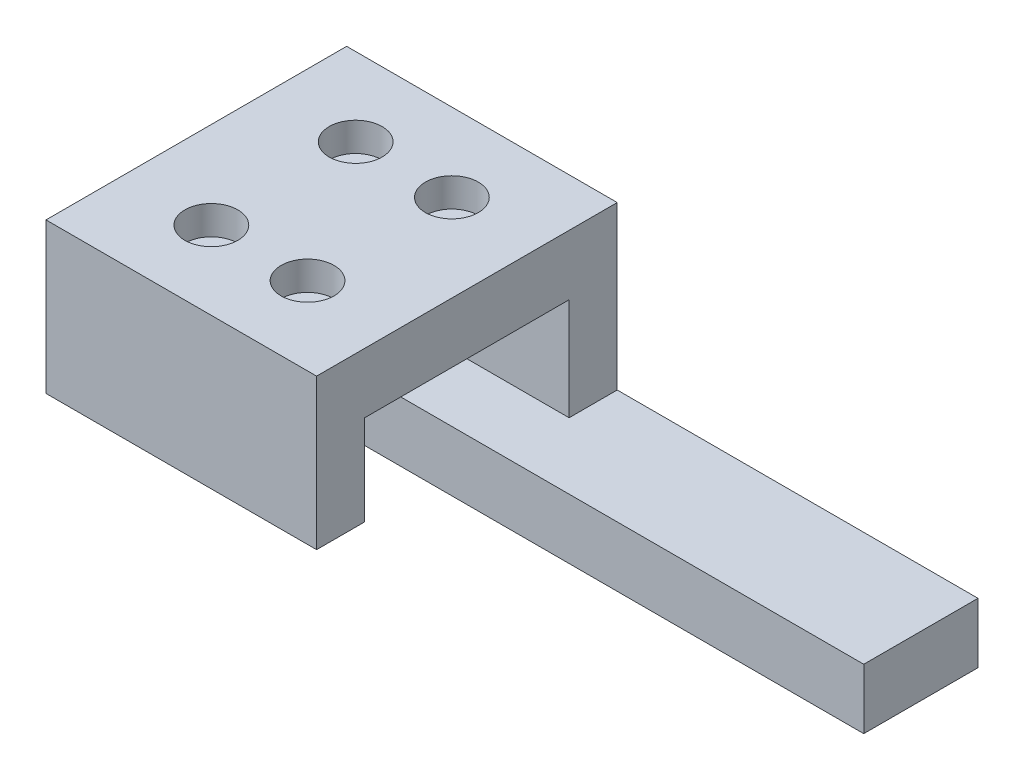
ISO-10303-21;
HEADER;
FILE_DESCRIPTION(('STEP AP214'),'2;1');
FILE_NAME('part.step','',(''),(''),'','','');
FILE_SCHEMA(('AUTOMOTIVE_DESIGN { 1 0 10303 214 1 1 1 1 }'));
ENDSEC;
DATA;
#1=APPLICATION_CONTEXT('core data for automotive mechanical design processes');
#2=APPLICATION_PROTOCOL_DEFINITION('international standard','automotive_design',2000,#1);
#3=PRODUCT_CONTEXT('',#1,'mechanical');
#4=PRODUCT('Part','Part','',(#3));
#5=PRODUCT_RELATED_PRODUCT_CATEGORY('part','',(#4));
#6=PRODUCT_DEFINITION_FORMATION('','',#4);
#7=PRODUCT_DEFINITION_CONTEXT('part definition',#1,'design');
#8=PRODUCT_DEFINITION('design','',#6,#7);
#9=PRODUCT_DEFINITION_SHAPE('','',#8);
#10=(LENGTH_UNIT() NAMED_UNIT(*) SI_UNIT(.MILLI.,.METRE.));
#11=(NAMED_UNIT(*) PLANE_ANGLE_UNIT() SI_UNIT($,.RADIAN.));
#12=(NAMED_UNIT(*) SI_UNIT($,.STERADIAN.) SOLID_ANGLE_UNIT());
#13=UNCERTAINTY_MEASURE_WITH_UNIT(LENGTH_MEASURE(1.E-05),#10,'distance_accuracy_value','');
#14=(GEOMETRIC_REPRESENTATION_CONTEXT(3) GLOBAL_UNCERTAINTY_ASSIGNED_CONTEXT((#13)) GLOBAL_UNIT_ASSIGNED_CONTEXT((#10,
#11,#12)) REPRESENTATION_CONTEXT('',''));
#15=CARTESIAN_POINT('',(0.,0.,0.));
#16=DIRECTION('',(0.,0.,1.));
#17=DIRECTION('',(1.,0.,0.));
#18=AXIS2_PLACEMENT_3D('',#15,#16,#17);
#19=CARTESIAN_POINT('',(0.,0.,0.));
#20=DIRECTION('',(0.,1.,0.));
#21=DIRECTION('',(0.,0.,1.));
#22=AXIS2_PLACEMENT_3D('',#19,#20,#21);
#23=PLANE('',#22);
#24=CARTESIAN_POINT('',(-4.,0.,6.));
#25=DIRECTION('',(0.,1.,0.));
#26=DIRECTION('',(0.,0.,1.));
#27=AXIS2_PLACEMENT_3D('',#24,#25,#26);
#28=CIRCLE('',#27,1.2);
#29=CARTESIAN_POINT('',(-4.,0.,7.2));
#30=VERTEX_POINT('',#29);
#31=EDGE_CURVE('E195',#30,#30,#28,.T.);
#32=ORIENTED_EDGE('',*,*,#31,.T.);
#33=EDGE_LOOP('',(#32));
#34=FACE_BOUND('',#33,.T.);
#35=CARTESIAN_POINT('',(4.,0.,6.));
#36=DIRECTION('',(0.,1.,0.));
#37=DIRECTION('',(0.,0.,1.));
#38=AXIS2_PLACEMENT_3D('',#35,#36,#37);
#39=CIRCLE('',#38,1.2);
#40=CARTESIAN_POINT('',(4.,0.,7.2));
#41=VERTEX_POINT('',#40);
#42=EDGE_CURVE('E199',#41,#41,#39,.T.);
#43=ORIENTED_EDGE('',*,*,#42,.T.);
#44=EDGE_LOOP('',(#43));
#45=FACE_BOUND('',#44,.T.);
#46=CARTESIAN_POINT('',(-4.,0.,-6.));
#47=DIRECTION('',(0.,1.,0.));
#48=DIRECTION('',(0.,0.,1.));
#49=AXIS2_PLACEMENT_3D('',#46,#47,#48);
#50=CIRCLE('',#49,1.2);
#51=CARTESIAN_POINT('',(-4.,0.,-4.8));
#52=VERTEX_POINT('',#51);
#53=EDGE_CURVE('E203',#52,#52,#50,.T.);
#54=ORIENTED_EDGE('',*,*,#53,.T.);
#55=EDGE_LOOP('',(#54));
#56=FACE_BOUND('',#55,.T.);
#57=CARTESIAN_POINT('',(4.,0.,-6.));
#58=DIRECTION('',(0.,1.,0.));
#59=DIRECTION('',(0.,0.,1.));
#60=AXIS2_PLACEMENT_3D('',#57,#58,#59);
#61=CIRCLE('',#60,1.2);
#62=CARTESIAN_POINT('',(4.,0.,-4.8));
#63=VERTEX_POINT('',#62);
#64=EDGE_CURVE('E73',#63,#63,#61,.T.);
#65=ORIENTED_EDGE('',*,*,#64,.T.);
#66=EDGE_LOOP('',(#65));
#67=FACE_BOUND('',#66,.T.);
#68=DIRECTION('',(1.,0.,0.));
#69=VECTOR('',#68,1.);
#70=CARTESIAN_POINT('',(0.,0.,8.5));
#71=LINE('',#70,#69);
#72=CARTESIAN_POINT('',(-11.25,0.,8.5));
#73=VERTEX_POINT('',#72);
#74=CARTESIAN_POINT('',(11.25,0.,8.5));
#75=VERTEX_POINT('',#74);
#76=EDGE_CURVE('E164',#73,#75,#71,.T.);
#77=ORIENTED_EDGE('',*,*,#76,.F.);
#78=DIRECTION('',(0.,0.,-1.));
#79=VECTOR('',#78,1.);
#80=CARTESIAN_POINT('',(-11.25,0.,8.5));
#81=LINE('',#80,#79);
#82=CARTESIAN_POINT('',(-11.25,0.,-8.5));
#83=VERTEX_POINT('',#82);
#84=EDGE_CURVE('E175',#73,#83,#81,.T.);
#85=ORIENTED_EDGE('',*,*,#84,.T.);
#86=DIRECTION('',(1.,0.,0.));
#87=VECTOR('',#86,1.);
#88=CARTESIAN_POINT('',(0.,0.,-8.5));
#89=LINE('',#88,#87);
#90=CARTESIAN_POINT('',(11.25,0.,-8.5));
#91=VERTEX_POINT('',#90);
#92=EDGE_CURVE('E174',#83,#91,#89,.T.);
#93=ORIENTED_EDGE('',*,*,#92,.T.);
#94=DIRECTION('',(0.,0.,-1.));
#95=VECTOR('',#94,1.);
#96=CARTESIAN_POINT('',(11.25,0.,8.5));
#97=LINE('',#96,#95);
#98=EDGE_CURVE('E158',#75,#91,#97,.T.);
#99=ORIENTED_EDGE('',*,*,#98,.F.);
#100=EDGE_LOOP('',(#77,#85,#93,#99));
#101=FACE_BOUND('',#100,.T.);
#102=ADVANCED_FACE('F69',(#34,#45,#56,#67,#101),#23,.F.);
#103=CARTESIAN_POINT('',(11.25,5.,8.5));
#104=DIRECTION('',(-1.,0.,0.));
#105=DIRECTION('',(0.,0.,1.));
#106=AXIS2_PLACEMENT_3D('',#103,#104,#105);
#107=PLANE('',#106);
#108=DIRECTION('',(0.,1.,0.));
#109=VECTOR('',#108,1.);
#110=CARTESIAN_POINT('',(11.25,-13.5,-8.5));
#111=LINE('',#110,#109);
#112=CARTESIAN_POINT('',(11.25,-8.5,-8.5));
#113=VERTEX_POINT('',#112);
#114=EDGE_CURVE('E238',#113,#91,#111,.T.);
#115=ORIENTED_EDGE('',*,*,#114,.F.);
#116=DIRECTION('',(0.,0.,1.));
#117=VECTOR('',#116,1.);
#118=CARTESIAN_POINT('',(11.25,-8.5,0.));
#119=LINE('',#118,#117);
#120=CARTESIAN_POINT('',(11.25,-8.5,-12.5));
#121=VERTEX_POINT('',#120);
#122=EDGE_CURVE('E86',#121,#113,#119,.T.);
#123=ORIENTED_EDGE('',*,*,#122,.F.);
#124=DIRECTION('',(0.,-1.,0.));
#125=VECTOR('',#124,1.);
#126=CARTESIAN_POINT('',(11.25,5.,-12.5));
#127=LINE('',#126,#125);
#128=CARTESIAN_POINT('',(11.25,5.,-12.5));
#129=VERTEX_POINT('',#128);
#130=EDGE_CURVE('E189',#129,#121,#127,.T.);
#131=ORIENTED_EDGE('',*,*,#130,.F.);
#132=DIRECTION('',(0.,0.,-1.));
#133=VECTOR('',#132,1.);
#134=CARTESIAN_POINT('',(11.25,5.,8.5));
#135=LINE('',#134,#133);
#136=CARTESIAN_POINT('',(11.25,5.,12.5));
#137=VERTEX_POINT('',#136);
#138=EDGE_CURVE('E78',#137,#129,#135,.T.);
#139=ORIENTED_EDGE('',*,*,#138,.F.);
#140=DIRECTION('',(0.,-1.,0.));
#141=VECTOR('',#140,1.);
#142=CARTESIAN_POINT('',(11.25,5.,12.5));
#143=LINE('',#142,#141);
#144=CARTESIAN_POINT('',(11.25,-7.5,12.5));
#145=VERTEX_POINT('',#144);
#146=EDGE_CURVE('E192',#137,#145,#143,.T.);
#147=ORIENTED_EDGE('',*,*,#146,.T.);
#148=DIRECTION('',(0.,0.,1.));
#149=VECTOR('',#148,1.);
#150=CARTESIAN_POINT('',(11.25,-7.5,0.));
#151=LINE('',#150,#149);
#152=CARTESIAN_POINT('',(11.25,-7.5,8.5));
#153=VERTEX_POINT('',#152);
#154=EDGE_CURVE('E160',#153,#145,#151,.T.);
#155=ORIENTED_EDGE('',*,*,#154,.F.);
#156=DIRECTION('',(0.,1.,0.));
#157=VECTOR('',#156,1.);
#158=CARTESIAN_POINT('',(11.25,-31.3527897640529,8.5));
#159=LINE('',#158,#157);
#160=EDGE_CURVE('E154',#153,#75,#159,.T.);
#161=ORIENTED_EDGE('',*,*,#160,.T.);
#162=ORIENTED_EDGE('',*,*,#98,.T.);
#163=EDGE_LOOP('',(#115,#123,#131,#139,#147,#155,#161,#162));
#164=FACE_BOUND('',#163,.T.);
#165=ADVANCED_FACE('F156',(#164),#107,.F.);
#166=CARTESIAN_POINT('',(-11.25,5.,8.5));
#167=DIRECTION('',(-1.,0.,0.));
#168=DIRECTION('',(0.,0.,1.));
#169=AXIS2_PLACEMENT_3D('',#166,#167,#168);
#170=PLANE('',#169);
#171=ORIENTED_EDGE('',*,*,#84,.F.);
#172=DIRECTION('',(0.,1.,0.));
#173=VECTOR('',#172,1.);
#174=CARTESIAN_POINT('',(-11.25,-31.3527897640529,8.5));
#175=LINE('',#174,#173);
#176=CARTESIAN_POINT('',(-11.25,-7.5,8.5));
#177=VERTEX_POINT('',#176);
#178=EDGE_CURVE('E163',#177,#73,#175,.T.);
#179=ORIENTED_EDGE('',*,*,#178,.F.);
#180=DIRECTION('',(0.,0.,1.));
#181=VECTOR('',#180,1.);
#182=CARTESIAN_POINT('',(-11.25,-7.5,0.));
#183=LINE('',#182,#181);
#184=CARTESIAN_POINT('',(-11.25,-7.5,12.5));
#185=VERTEX_POINT('',#184);
#186=EDGE_CURVE('E349',#177,#185,#183,.T.);
#187=ORIENTED_EDGE('',*,*,#186,.T.);
#188=DIRECTION('',(0.,-1.,0.));
#189=VECTOR('',#188,1.);
#190=CARTESIAN_POINT('',(-11.25,5.,12.5));
#191=LINE('',#190,#189);
#192=CARTESIAN_POINT('',(-11.25,5.,12.5));
#193=VERTEX_POINT('',#192);
#194=EDGE_CURVE('E179',#193,#185,#191,.T.);
#195=ORIENTED_EDGE('',*,*,#194,.F.);
#196=DIRECTION('',(0.,0.,-1.));
#197=VECTOR('',#196,1.);
#198=CARTESIAN_POINT('',(-11.25,5.,8.5));
#199=LINE('',#198,#197);
#200=CARTESIAN_POINT('',(-11.25,5.,-12.5));
#201=VERTEX_POINT('',#200);
#202=EDGE_CURVE('E14',#193,#201,#199,.T.);
#203=ORIENTED_EDGE('',*,*,#202,.T.);
#204=DIRECTION('',(0.,-1.,0.));
#205=VECTOR('',#204,1.);
#206=CARTESIAN_POINT('',(-11.25,5.,-12.5));
#207=LINE('',#206,#205);
#208=CARTESIAN_POINT('',(-11.25,-13.5,-12.5));
#209=VERTEX_POINT('',#208);
#210=EDGE_CURVE('E176',#201,#209,#207,.T.);
#211=ORIENTED_EDGE('',*,*,#210,.T.);
#212=DIRECTION('',(0.,0.,-1.));
#213=VECTOR('',#212,1.);
#214=CARTESIAN_POINT('',(-11.25,-13.5,0.));
#215=LINE('',#214,#213);
#216=CARTESIAN_POINT('',(-11.25,-13.5,-3.));
#217=VERTEX_POINT('',#216);
#218=EDGE_CURVE('E235',#217,#209,#215,.T.);
#219=ORIENTED_EDGE('',*,*,#218,.F.);
#220=DIRECTION('',(0.,-1.,0.));
#221=VECTOR('',#220,1.);
#222=CARTESIAN_POINT('',(-11.25,53.352600686377,-3.));
#223=LINE('',#222,#221);
#224=CARTESIAN_POINT('',(-11.25,-8.5,-3.));
#225=VERTEX_POINT('',#224);
#226=EDGE_CURVE('E269',#225,#217,#223,.T.);
#227=ORIENTED_EDGE('',*,*,#226,.F.);
#228=DIRECTION('',(0.,0.,1.));
#229=VECTOR('',#228,1.);
#230=CARTESIAN_POINT('',(-11.25,-8.5,0.));
#231=LINE('',#230,#229);
#232=CARTESIAN_POINT('',(-11.25,-8.5,-8.5));
#233=VERTEX_POINT('',#232);
#234=EDGE_CURVE('E284',#233,#225,#231,.T.);
#235=ORIENTED_EDGE('',*,*,#234,.F.);
#236=DIRECTION('',(0.,1.,0.));
#237=VECTOR('',#236,1.);
#238=CARTESIAN_POINT('',(-11.25,-13.5,-8.5));
#239=LINE('',#238,#237);
#240=EDGE_CURVE('E187',#233,#83,#239,.T.);
#241=ORIENTED_EDGE('',*,*,#240,.T.);
#242=EDGE_LOOP('',(#171,#179,#187,#195,#203,#211,#219,#227,#235,#241));
#243=FACE_BOUND('',#242,.T.);
#244=ADVANCED_FACE('F254',(#243),#170,.T.);
#245=CARTESIAN_POINT('',(0.,5.,0.));
#246=DIRECTION('',(0.,1.,0.));
#247=DIRECTION('',(0.,0.,1.));
#248=AXIS2_PLACEMENT_3D('',#245,#246,#247);
#249=PLANE('',#248);
#250=CARTESIAN_POINT('',(4.,5.,-6.));
#251=DIRECTION('',(0.,1.,0.));
#252=DIRECTION('',(0.,0.,1.));
#253=AXIS2_PLACEMENT_3D('',#250,#251,#252);
#254=CIRCLE('',#253,2.2);
#255=CARTESIAN_POINT('',(4.,5.,-3.8));
#256=VERTEX_POINT('',#255);
#257=EDGE_CURVE('E289',#256,#256,#254,.T.);
#258=ORIENTED_EDGE('',*,*,#257,.F.);
#259=EDGE_LOOP('',(#258));
#260=FACE_BOUND('',#259,.T.);
#261=CARTESIAN_POINT('',(-4.,5.,-6.));
#262=DIRECTION('',(0.,1.,0.));
#263=DIRECTION('',(0.,0.,1.));
#264=AXIS2_PLACEMENT_3D('',#261,#262,#263);
#265=CIRCLE('',#264,2.2);
#266=CARTESIAN_POINT('',(-4.,5.,-3.8));
#267=VERTEX_POINT('',#266);
#268=EDGE_CURVE('E218',#267,#267,#265,.T.);
#269=ORIENTED_EDGE('',*,*,#268,.F.);
#270=EDGE_LOOP('',(#269));
#271=FACE_BOUND('',#270,.T.);
#272=CARTESIAN_POINT('',(4.,5.,6.));
#273=DIRECTION('',(0.,1.,0.));
#274=DIRECTION('',(0.,0.,1.));
#275=AXIS2_PLACEMENT_3D('',#272,#273,#274);
#276=CIRCLE('',#275,2.2);
#277=CARTESIAN_POINT('',(4.,5.,8.2));
#278=VERTEX_POINT('',#277);
#279=EDGE_CURVE('E205',#278,#278,#276,.T.);
#280=ORIENTED_EDGE('',*,*,#279,.F.);
#281=EDGE_LOOP('',(#280));
#282=FACE_BOUND('',#281,.T.);
#283=CARTESIAN_POINT('',(-4.,5.,6.));
#284=DIRECTION('',(0.,1.,0.));
#285=DIRECTION('',(0.,0.,1.));
#286=AXIS2_PLACEMENT_3D('',#283,#284,#285);
#287=CIRCLE('',#286,2.2);
#288=CARTESIAN_POINT('',(-4.,5.,8.2));
#289=VERTEX_POINT('',#288);
#290=EDGE_CURVE('E201',#289,#289,#287,.T.);
#291=ORIENTED_EDGE('',*,*,#290,.F.);
#292=EDGE_LOOP('',(#291));
#293=FACE_BOUND('',#292,.T.);
#294=ORIENTED_EDGE('',*,*,#138,.T.);
#295=DIRECTION('',(1.,0.,0.));
#296=VECTOR('',#295,1.);
#297=CARTESIAN_POINT('',(-11.25,5.,-12.5));
#298=LINE('',#297,#296);
#299=EDGE_CURVE('E183',#201,#129,#298,.T.);
#300=ORIENTED_EDGE('',*,*,#299,.F.);
#301=ORIENTED_EDGE('',*,*,#202,.F.);
#302=DIRECTION('',(1.,0.,0.));
#303=VECTOR('',#302,1.);
#304=CARTESIAN_POINT('',(-11.25,5.,12.5));
#305=LINE('',#304,#303);
#306=EDGE_CURVE('E186',#193,#137,#305,.T.);
#307=ORIENTED_EDGE('',*,*,#306,.T.);
#308=EDGE_LOOP('',(#294,#300,#301,#307));
#309=FACE_BOUND('',#308,.T.);
#310=ADVANCED_FACE('F244',(#260,#271,#282,#293,#309),#249,.T.);
#311=CARTESIAN_POINT('',(-11.25,5.,12.5));
#312=DIRECTION('',(0.,0.,-1.));
#313=DIRECTION('',(-1.,0.,0.));
#314=AXIS2_PLACEMENT_3D('',#311,#312,#313);
#315=PLANE('',#314);
#316=ORIENTED_EDGE('',*,*,#194,.T.);
#317=DIRECTION('',(-1.,0.,0.));
#318=VECTOR('',#317,1.);
#319=CARTESIAN_POINT('',(0.,-7.5,12.5));
#320=LINE('',#319,#318);
#321=EDGE_CURVE('E345',#145,#185,#320,.T.);
#322=ORIENTED_EDGE('',*,*,#321,.F.);
#323=ORIENTED_EDGE('',*,*,#146,.F.);
#324=ORIENTED_EDGE('',*,*,#306,.F.);
#325=EDGE_LOOP('',(#316,#322,#323,#324));
#326=FACE_BOUND('',#325,.T.);
#327=ADVANCED_FACE('F333',(#326),#315,.F.);
#328=CARTESIAN_POINT('',(-11.25,5.,-12.5));
#329=DIRECTION('',(0.,0.,-1.));
#330=DIRECTION('',(-1.,0.,0.));
#331=AXIS2_PLACEMENT_3D('',#328,#329,#330);
#332=PLANE('',#331);
#333=ORIENTED_EDGE('',*,*,#130,.T.);
#334=DIRECTION('',(1.,0.,0.));
#335=VECTOR('',#334,1.);
#336=CARTESIAN_POINT('',(0.,-8.5,-12.5));
#337=LINE('',#336,#335);
#338=CARTESIAN_POINT('',(41.25,-8.5,-12.5));
#339=VERTEX_POINT('',#338);
#340=EDGE_CURVE('E268',#121,#339,#337,.T.);
#341=ORIENTED_EDGE('',*,*,#340,.T.);
#342=DIRECTION('',(0.,-1.,0.));
#343=VECTOR('',#342,1.);
#344=CARTESIAN_POINT('',(41.25,53.352600686377,-12.5));
#345=LINE('',#344,#343);
#346=CARTESIAN_POINT('',(41.25,-13.5,-12.5));
#347=VERTEX_POINT('',#346);
#348=EDGE_CURVE('E271',#339,#347,#345,.T.);
#349=ORIENTED_EDGE('',*,*,#348,.T.);
#350=DIRECTION('',(1.,0.,0.));
#351=VECTOR('',#350,1.);
#352=CARTESIAN_POINT('',(0.,-13.5,-12.5));
#353=LINE('',#352,#351);
#354=EDGE_CURVE('E233',#209,#347,#353,.T.);
#355=ORIENTED_EDGE('',*,*,#354,.F.);
#356=ORIENTED_EDGE('',*,*,#210,.F.);
#357=ORIENTED_EDGE('',*,*,#299,.T.);
#358=EDGE_LOOP('',(#333,#341,#349,#355,#356,#357));
#359=FACE_BOUND('',#358,.T.);
#360=ADVANCED_FACE('F71',(#359),#332,.T.);
#361=CARTESIAN_POINT('',(0.,-13.5,-8.5));
#362=DIRECTION('',(0.,0.,1.));
#363=DIRECTION('',(1.,0.,0.));
#364=AXIS2_PLACEMENT_3D('',#361,#362,#363);
#365=PLANE('',#364);
#366=DIRECTION('',(-1.,0.,0.));
#367=VECTOR('',#366,1.);
#368=CARTESIAN_POINT('',(0.,-8.5,-8.5));
#369=LINE('',#368,#367);
#370=EDGE_CURVE('E94',#113,#233,#369,.T.);
#371=ORIENTED_EDGE('',*,*,#370,.F.);
#372=ORIENTED_EDGE('',*,*,#114,.T.);
#373=ORIENTED_EDGE('',*,*,#92,.F.);
#374=ORIENTED_EDGE('',*,*,#240,.F.);
#375=EDGE_LOOP('',(#371,#372,#373,#374));
#376=FACE_BOUND('',#375,.T.);
#377=ADVANCED_FACE('F340',(#376),#365,.T.);
#378=CARTESIAN_POINT('',(0.,-13.5,0.));
#379=DIRECTION('',(0.,1.,0.));
#380=DIRECTION('',(0.,0.,1.));
#381=AXIS2_PLACEMENT_3D('',#378,#379,#380);
#382=PLANE('',#381);
#383=DIRECTION('',(1.,0.,0.));
#384=VECTOR('',#383,1.);
#385=CARTESIAN_POINT('',(0.,-13.5,-3.));
#386=LINE('',#385,#384);
#387=CARTESIAN_POINT('',(41.25,-13.5,-3.));
#388=VERTEX_POINT('',#387);
#389=EDGE_CURVE('E263',#217,#388,#386,.T.);
#390=ORIENTED_EDGE('',*,*,#389,.F.);
#391=ORIENTED_EDGE('',*,*,#218,.T.);
#392=ORIENTED_EDGE('',*,*,#354,.T.);
#393=DIRECTION('',(0.,0.,1.));
#394=VECTOR('',#393,1.);
#395=CARTESIAN_POINT('',(41.25,-13.5,0.));
#396=LINE('',#395,#394);
#397=EDGE_CURVE('E265',#347,#388,#396,.T.);
#398=ORIENTED_EDGE('',*,*,#397,.T.);
#399=EDGE_LOOP('',(#390,#391,#392,#398));
#400=FACE_BOUND('',#399,.T.);
#401=ADVANCED_FACE('F260',(#400),#382,.F.);
#402=CARTESIAN_POINT('',(-4.,5.,6.));
#403=DIRECTION('',(0.,1.,0.));
#404=DIRECTION('',(0.,0.,1.));
#405=AXIS2_PLACEMENT_3D('',#402,#403,#404);
#406=CYLINDRICAL_SURFACE('',#405,1.2);
#407=CARTESIAN_POINT('',(-4.,2.6,6.));
#408=DIRECTION('',(0.,1.,0.));
#409=DIRECTION('',(0.,0.,1.));
#410=AXIS2_PLACEMENT_3D('',#407,#408,#409);
#411=CIRCLE('',#410,1.2);
#412=CARTESIAN_POINT('',(-4.,2.6,7.2));
#413=VERTEX_POINT('',#412);
#414=EDGE_CURVE('E198',#413,#413,#411,.T.);
#415=ORIENTED_EDGE('',*,*,#414,.T.);
#416=EDGE_LOOP('',(#415));
#417=FACE_BOUND('',#416,.T.);
#418=ORIENTED_EDGE('',*,*,#31,.F.);
#419=EDGE_LOOP('',(#418));
#420=FACE_BOUND('',#419,.T.);
#421=ADVANCED_FACE('F399',(#417,#420),#406,.F.);
#422=CARTESIAN_POINT('',(-2.8,2.6,6.));
#423=DIRECTION('',(0.,-1.,0.));
#424=DIRECTION('',(0.,0.,-1.));
#425=AXIS2_PLACEMENT_3D('',#422,#423,#424);
#426=PLANE('',#425);
#427=ORIENTED_EDGE('',*,*,#414,.F.);
#428=EDGE_LOOP('',(#427));
#429=FACE_BOUND('',#428,.T.);
#430=CARTESIAN_POINT('',(-4.,2.6,6.));
#431=DIRECTION('',(0.,1.,0.));
#432=DIRECTION('',(0.,0.,1.));
#433=AXIS2_PLACEMENT_3D('',#430,#431,#432);
#434=CIRCLE('',#433,2.2);
#435=CARTESIAN_POINT('',(-4.,2.6,8.2));
#436=VERTEX_POINT('',#435);
#437=EDGE_CURVE('E228',#436,#436,#434,.T.);
#438=ORIENTED_EDGE('',*,*,#437,.T.);
#439=EDGE_LOOP('',(#438));
#440=FACE_BOUND('',#439,.T.);
#441=ADVANCED_FACE('F389',(#429,#440),#426,.F.);
#442=CARTESIAN_POINT('',(-4.,5.,6.));
#443=DIRECTION('',(0.,1.,0.));
#444=DIRECTION('',(0.,0.,1.));
#445=AXIS2_PLACEMENT_3D('',#442,#443,#444);
#446=CYLINDRICAL_SURFACE('',#445,2.2);
#447=ORIENTED_EDGE('',*,*,#437,.F.);
#448=EDGE_LOOP('',(#447));
#449=FACE_BOUND('',#448,.T.);
#450=ORIENTED_EDGE('',*,*,#290,.T.);
#451=EDGE_LOOP('',(#450));
#452=FACE_BOUND('',#451,.T.);
#453=ADVANCED_FACE('F386',(#449,#452),#446,.F.);
#454=CARTESIAN_POINT('',(4.,5.,6.));
#455=DIRECTION('',(0.,1.,0.));
#456=DIRECTION('',(0.,0.,1.));
#457=AXIS2_PLACEMENT_3D('',#454,#455,#456);
#458=CYLINDRICAL_SURFACE('',#457,1.2);
#459=CARTESIAN_POINT('',(4.,2.6,6.));
#460=DIRECTION('',(0.,1.,0.));
#461=DIRECTION('',(0.,0.,1.));
#462=AXIS2_PLACEMENT_3D('',#459,#460,#461);
#463=CIRCLE('',#462,1.2);
#464=CARTESIAN_POINT('',(4.,2.6,7.2));
#465=VERTEX_POINT('',#464);
#466=EDGE_CURVE('E202',#465,#465,#463,.T.);
#467=ORIENTED_EDGE('',*,*,#466,.T.);
#468=EDGE_LOOP('',(#467));
#469=FACE_BOUND('',#468,.T.);
#470=ORIENTED_EDGE('',*,*,#42,.F.);
#471=EDGE_LOOP('',(#470));
#472=FACE_BOUND('',#471,.T.);
#473=ADVANCED_FACE('F388',(#469,#472),#458,.F.);
#474=CARTESIAN_POINT('',(5.2,2.6,6.));
#475=DIRECTION('',(0.,-1.,0.));
#476=DIRECTION('',(0.,0.,-1.));
#477=AXIS2_PLACEMENT_3D('',#474,#475,#476);
#478=PLANE('',#477);
#479=ORIENTED_EDGE('',*,*,#466,.F.);
#480=EDGE_LOOP('',(#479));
#481=FACE_BOUND('',#480,.T.);
#482=CARTESIAN_POINT('',(4.,2.6,6.));
#483=DIRECTION('',(0.,1.,0.));
#484=DIRECTION('',(0.,0.,1.));
#485=AXIS2_PLACEMENT_3D('',#482,#483,#484);
#486=CIRCLE('',#485,2.2);
#487=CARTESIAN_POINT('',(4.,2.6,8.2));
#488=VERTEX_POINT('',#487);
#489=EDGE_CURVE('E210',#488,#488,#486,.T.);
#490=ORIENTED_EDGE('',*,*,#489,.T.);
#491=EDGE_LOOP('',(#490));
#492=FACE_BOUND('',#491,.T.);
#493=ADVANCED_FACE('F396',(#481,#492),#478,.F.);
#494=CARTESIAN_POINT('',(4.,5.,6.));
#495=DIRECTION('',(0.,1.,0.));
#496=DIRECTION('',(0.,0.,1.));
#497=AXIS2_PLACEMENT_3D('',#494,#495,#496);
#498=CYLINDRICAL_SURFACE('',#497,2.2);
#499=ORIENTED_EDGE('',*,*,#489,.F.);
#500=EDGE_LOOP('',(#499));
#501=FACE_BOUND('',#500,.T.);
#502=ORIENTED_EDGE('',*,*,#279,.T.);
#503=EDGE_LOOP('',(#502));
#504=FACE_BOUND('',#503,.T.);
#505=ADVANCED_FACE('F546',(#501,#504),#498,.F.);
#506=CARTESIAN_POINT('',(-4.,5.,-6.));
#507=DIRECTION('',(0.,1.,0.));
#508=DIRECTION('',(0.,0.,1.));
#509=AXIS2_PLACEMENT_3D('',#506,#507,#508);
#510=CYLINDRICAL_SURFACE('',#509,1.2);
#511=CARTESIAN_POINT('',(-4.,2.6,-6.));
#512=DIRECTION('',(0.,1.,0.));
#513=DIRECTION('',(0.,0.,1.));
#514=AXIS2_PLACEMENT_3D('',#511,#512,#513);
#515=CIRCLE('',#514,1.2);
#516=CARTESIAN_POINT('',(-4.,2.6,-4.8));
#517=VERTEX_POINT('',#516);
#518=EDGE_CURVE('E206',#517,#517,#515,.T.);
#519=ORIENTED_EDGE('',*,*,#518,.T.);
#520=EDGE_LOOP('',(#519));
#521=FACE_BOUND('',#520,.T.);
#522=ORIENTED_EDGE('',*,*,#53,.F.);
#523=EDGE_LOOP('',(#522));
#524=FACE_BOUND('',#523,.T.);
#525=ADVANCED_FACE('F555',(#521,#524),#510,.F.);
#526=CARTESIAN_POINT('',(-2.8,2.6,-6.));
#527=DIRECTION('',(0.,-1.,0.));
#528=DIRECTION('',(0.,0.,-1.));
#529=AXIS2_PLACEMENT_3D('',#526,#527,#528);
#530=PLANE('',#529);
#531=ORIENTED_EDGE('',*,*,#518,.F.);
#532=EDGE_LOOP('',(#531));
#533=FACE_BOUND('',#532,.T.);
#534=CARTESIAN_POINT('',(-4.,2.6,-6.));
#535=DIRECTION('',(0.,1.,0.));
#536=DIRECTION('',(0.,0.,1.));
#537=AXIS2_PLACEMENT_3D('',#534,#535,#536);
#538=CIRCLE('',#537,2.2);
#539=CARTESIAN_POINT('',(-4.,2.6,-3.8));
#540=VERTEX_POINT('',#539);
#541=EDGE_CURVE('E213',#540,#540,#538,.T.);
#542=ORIENTED_EDGE('',*,*,#541,.T.);
#543=EDGE_LOOP('',(#542));
#544=FACE_BOUND('',#543,.T.);
#545=ADVANCED_FACE('F317',(#533,#544),#530,.F.);
#546=CARTESIAN_POINT('',(-4.,5.,-6.));
#547=DIRECTION('',(0.,1.,0.));
#548=DIRECTION('',(0.,0.,1.));
#549=AXIS2_PLACEMENT_3D('',#546,#547,#548);
#550=CYLINDRICAL_SURFACE('',#549,2.2);
#551=ORIENTED_EDGE('',*,*,#541,.F.);
#552=EDGE_LOOP('',(#551));
#553=FACE_BOUND('',#552,.T.);
#554=ORIENTED_EDGE('',*,*,#268,.T.);
#555=EDGE_LOOP('',(#554));
#556=FACE_BOUND('',#555,.T.);
#557=ADVANCED_FACE('F307',(#553,#556),#550,.F.);
#558=CARTESIAN_POINT('',(4.,5.,-6.));
#559=DIRECTION('',(0.,1.,0.));
#560=DIRECTION('',(0.,0.,1.));
#561=AXIS2_PLACEMENT_3D('',#558,#559,#560);
#562=CYLINDRICAL_SURFACE('',#561,1.2);
#563=CARTESIAN_POINT('',(4.,2.6,-6.));
#564=DIRECTION('',(0.,1.,0.));
#565=DIRECTION('',(0.,0.,1.));
#566=AXIS2_PLACEMENT_3D('',#563,#564,#565);
#567=CIRCLE('',#566,1.2);
#568=CARTESIAN_POINT('',(4.,2.6,-4.8));
#569=VERTEX_POINT('',#568);
#570=EDGE_CURVE('E295',#569,#569,#567,.T.);
#571=ORIENTED_EDGE('',*,*,#570,.T.);
#572=EDGE_LOOP('',(#571));
#573=FACE_BOUND('',#572,.T.);
#574=ORIENTED_EDGE('',*,*,#64,.F.);
#575=EDGE_LOOP('',(#574));
#576=FACE_BOUND('',#575,.T.);
#577=ADVANCED_FACE('F304',(#573,#576),#562,.F.);
#578=CARTESIAN_POINT('',(5.2,2.6,-6.));
#579=DIRECTION('',(0.,-1.,0.));
#580=DIRECTION('',(0.,0.,-1.));
#581=AXIS2_PLACEMENT_3D('',#578,#579,#580);
#582=PLANE('',#581);
#583=ORIENTED_EDGE('',*,*,#570,.F.);
#584=EDGE_LOOP('',(#583));
#585=FACE_BOUND('',#584,.T.);
#586=CARTESIAN_POINT('',(4.,2.6,-6.));
#587=DIRECTION('',(0.,1.,0.));
#588=DIRECTION('',(0.,0.,1.));
#589=AXIS2_PLACEMENT_3D('',#586,#587,#588);
#590=CIRCLE('',#589,2.2);
#591=CARTESIAN_POINT('',(4.,2.6,-3.8));
#592=VERTEX_POINT('',#591);
#593=EDGE_CURVE('E292',#592,#592,#590,.T.);
#594=ORIENTED_EDGE('',*,*,#593,.T.);
#595=EDGE_LOOP('',(#594));
#596=FACE_BOUND('',#595,.T.);
#597=ADVANCED_FACE('F306',(#585,#596),#582,.F.);
#598=CARTESIAN_POINT('',(4.,5.,-6.));
#599=DIRECTION('',(0.,1.,0.));
#600=DIRECTION('',(0.,0.,1.));
#601=AXIS2_PLACEMENT_3D('',#598,#599,#600);
#602=CYLINDRICAL_SURFACE('',#601,2.2);
#603=ORIENTED_EDGE('',*,*,#593,.F.);
#604=EDGE_LOOP('',(#603));
#605=FACE_BOUND('',#604,.T.);
#606=ORIENTED_EDGE('',*,*,#257,.T.);
#607=EDGE_LOOP('',(#606));
#608=FACE_BOUND('',#607,.T.);
#609=ADVANCED_FACE('F314',(#605,#608),#602,.F.);
#610=CARTESIAN_POINT('',(0.,-8.5,0.));
#611=DIRECTION('',(0.,1.,0.));
#612=DIRECTION('',(0.,0.,1.));
#613=AXIS2_PLACEMENT_3D('',#610,#611,#612);
#614=PLANE('',#613);
#615=ORIENTED_EDGE('',*,*,#340,.F.);
#616=ORIENTED_EDGE('',*,*,#122,.T.);
#617=ORIENTED_EDGE('',*,*,#370,.T.);
#618=ORIENTED_EDGE('',*,*,#234,.T.);
#619=DIRECTION('',(1.,0.,0.));
#620=VECTOR('',#619,1.);
#621=CARTESIAN_POINT('',(0.,-8.5,-3.));
#622=LINE('',#621,#620);
#623=CARTESIAN_POINT('',(41.25,-8.5,-3.));
#624=VERTEX_POINT('',#623);
#625=EDGE_CURVE('E279',#225,#624,#622,.T.);
#626=ORIENTED_EDGE('',*,*,#625,.T.);
#627=DIRECTION('',(0.,0.,1.));
#628=VECTOR('',#627,1.);
#629=CARTESIAN_POINT('',(41.25,-8.5,0.));
#630=LINE('',#629,#628);
#631=EDGE_CURVE('E278',#339,#624,#630,.T.);
#632=ORIENTED_EDGE('',*,*,#631,.F.);
#633=EDGE_LOOP('',(#615,#616,#617,#618,#626,#632));
#634=FACE_BOUND('',#633,.T.);
#635=ADVANCED_FACE('F357',(#634),#614,.T.);
#636=CARTESIAN_POINT('',(41.25,53.352600686377,0.));
#637=DIRECTION('',(1.,0.,0.));
#638=DIRECTION('',(0.,0.,-1.));
#639=AXIS2_PLACEMENT_3D('',#636,#637,#638);
#640=PLANE('',#639);
#641=ORIENTED_EDGE('',*,*,#348,.F.);
#642=ORIENTED_EDGE('',*,*,#631,.T.);
#643=DIRECTION('',(0.,-1.,0.));
#644=VECTOR('',#643,1.);
#645=CARTESIAN_POINT('',(41.25,53.352600686377,-3.));
#646=LINE('',#645,#644);
#647=EDGE_CURVE('E273',#624,#388,#646,.T.);
#648=ORIENTED_EDGE('',*,*,#647,.T.);
#649=ORIENTED_EDGE('',*,*,#397,.F.);
#650=EDGE_LOOP('',(#641,#642,#648,#649));
#651=FACE_BOUND('',#650,.T.);
#652=ADVANCED_FACE('F360',(#651),#640,.T.);
#653=CARTESIAN_POINT('',(0.,53.352600686377,-3.));
#654=DIRECTION('',(0.,0.,-1.));
#655=DIRECTION('',(-1.,0.,0.));
#656=AXIS2_PLACEMENT_3D('',#653,#654,#655);
#657=PLANE('',#656);
#658=ORIENTED_EDGE('',*,*,#625,.F.);
#659=ORIENTED_EDGE('',*,*,#226,.T.);
#660=ORIENTED_EDGE('',*,*,#389,.T.);
#661=ORIENTED_EDGE('',*,*,#647,.F.);
#662=EDGE_LOOP('',(#658,#659,#660,#661));
#663=FACE_BOUND('',#662,.T.);
#664=ADVANCED_FACE('F362',(#663),#657,.F.);
#665=CARTESIAN_POINT('',(0.,-31.3527897640529,8.5));
#666=DIRECTION('',(0.,0.,1.));
#667=DIRECTION('',(1.,0.,0.));
#668=AXIS2_PLACEMENT_3D('',#665,#666,#667);
#669=PLANE('',#668);
#670=ORIENTED_EDGE('',*,*,#160,.F.);
#671=DIRECTION('',(-1.,0.,0.));
#672=VECTOR('',#671,1.);
#673=CARTESIAN_POINT('',(0.,-7.5,8.5));
#674=LINE('',#673,#672);
#675=EDGE_CURVE('E351',#153,#177,#674,.T.);
#676=ORIENTED_EDGE('',*,*,#675,.T.);
#677=ORIENTED_EDGE('',*,*,#178,.T.);
#678=ORIENTED_EDGE('',*,*,#76,.T.);
#679=EDGE_LOOP('',(#670,#676,#677,#678));
#680=FACE_BOUND('',#679,.T.);
#681=ADVANCED_FACE('F167',(#680),#669,.F.);
#682=CARTESIAN_POINT('',(0.,-7.5,0.));
#683=DIRECTION('',(0.,1.,0.));
#684=DIRECTION('',(0.,0.,1.));
#685=AXIS2_PLACEMENT_3D('',#682,#683,#684);
#686=PLANE('',#685);
#687=ORIENTED_EDGE('',*,*,#321,.T.);
#688=ORIENTED_EDGE('',*,*,#186,.F.);
#689=ORIENTED_EDGE('',*,*,#675,.F.);
#690=ORIENTED_EDGE('',*,*,#154,.T.);
#691=EDGE_LOOP('',(#687,#688,#689,#690));
#692=FACE_BOUND('',#691,.T.);
#693=ADVANCED_FACE('F348',(#692),#686,.F.);
#694=CLOSED_SHELL('',(#102,#165,#244,#310,#327,#360,#377,#401,#421,#441,#453,#473,#493,#505,
#525,#545,#557,#577,#597,#609,#635,#652,#664,#681,#693));
#695=MANIFOLD_SOLID_BREP('B2',#694);
#696=ADVANCED_BREP_SHAPE_REPRESENTATION('',(#18,#695),#14);
#697=SHAPE_DEFINITION_REPRESENTATION(#9,#696);
ENDSEC;
END-ISO-10303-21;
